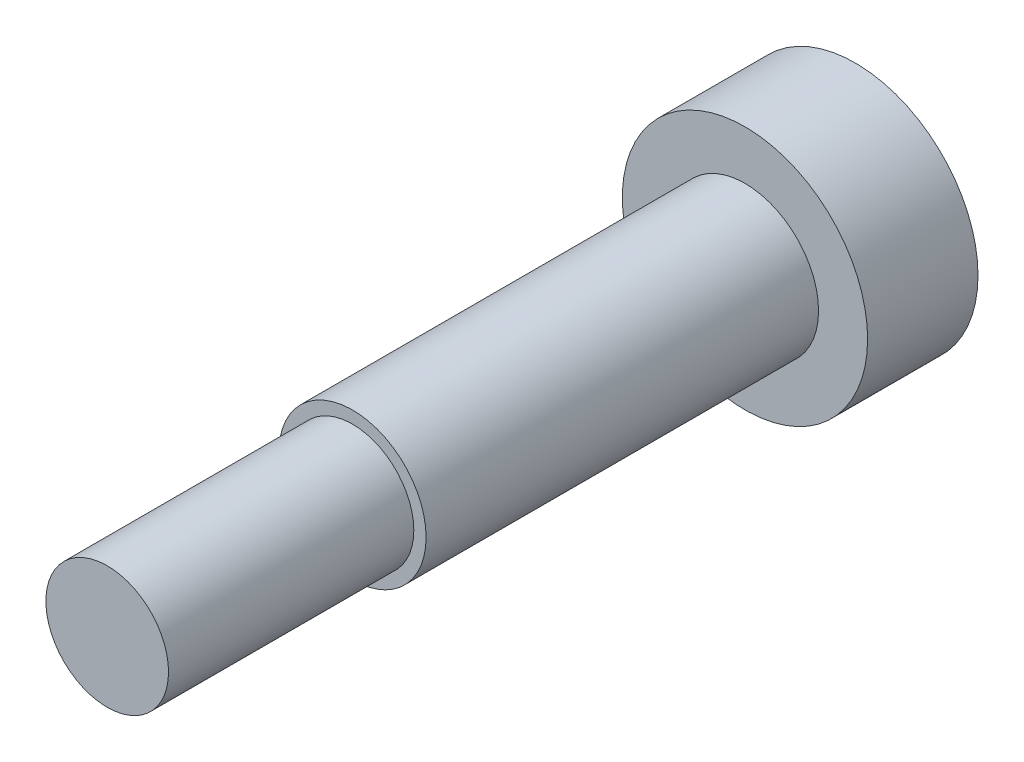
ISO-10303-21;
HEADER;
FILE_DESCRIPTION(('STEP AP214'),'2;1');
FILE_NAME('part.step','',(''),(''),'','','');
FILE_SCHEMA(('AUTOMOTIVE_DESIGN { 1 0 10303 214 1 1 1 1 }'));
ENDSEC;
DATA;
#1=APPLICATION_CONTEXT('core data for automotive mechanical design processes');
#2=APPLICATION_PROTOCOL_DEFINITION('international standard','automotive_design',2000,#1);
#3=PRODUCT_CONTEXT('',#1,'mechanical');
#4=PRODUCT('Part','Part','',(#3));
#5=PRODUCT_RELATED_PRODUCT_CATEGORY('part','',(#4));
#6=PRODUCT_DEFINITION_FORMATION('','',#4);
#7=PRODUCT_DEFINITION_CONTEXT('part definition',#1,'design');
#8=PRODUCT_DEFINITION('design','',#6,#7);
#9=PRODUCT_DEFINITION_SHAPE('','',#8);
#10=(LENGTH_UNIT() NAMED_UNIT(*) SI_UNIT(.MILLI.,.METRE.));
#11=(NAMED_UNIT(*) PLANE_ANGLE_UNIT() SI_UNIT($,.RADIAN.));
#12=(NAMED_UNIT(*) SI_UNIT($,.STERADIAN.) SOLID_ANGLE_UNIT());
#13=UNCERTAINTY_MEASURE_WITH_UNIT(LENGTH_MEASURE(1.E-05),#10,'distance_accuracy_value','');
#14=(GEOMETRIC_REPRESENTATION_CONTEXT(3) GLOBAL_UNCERTAINTY_ASSIGNED_CONTEXT((#13)) GLOBAL_UNIT_ASSIGNED_CONTEXT((#10,
#11,#12)) REPRESENTATION_CONTEXT('',''));
#15=CARTESIAN_POINT('',(0.,0.,0.));
#16=DIRECTION('',(0.,0.,1.));
#17=DIRECTION('',(1.,0.,0.));
#18=AXIS2_PLACEMENT_3D('',#15,#16,#17);
#19=CARTESIAN_POINT('',(0.,0.,4.5));
#20=DIRECTION('',(0.,0.,-1.));
#21=DIRECTION('',(-1.,0.,0.));
#22=AXIS2_PLACEMENT_3D('',#19,#20,#21);
#23=CYLINDRICAL_SURFACE('',#22,5.);
#24=CARTESIAN_POINT('',(0.,0.,4.5));
#25=DIRECTION('',(0.,0.,1.));
#26=DIRECTION('',(1.,0.,0.));
#27=AXIS2_PLACEMENT_3D('',#24,#25,#26);
#28=CIRCLE('',#27,5.);
#29=CARTESIAN_POINT('',(5.,0.,4.5));
#30=VERTEX_POINT('',#29);
#31=EDGE_CURVE('E142',#30,#30,#28,.T.);
#32=ORIENTED_EDGE('',*,*,#31,.F.);
#33=EDGE_LOOP('',(#32));
#34=FACE_BOUND('',#33,.T.);
#35=CARTESIAN_POINT('',(0.,0.,0.));
#36=DIRECTION('',(0.,0.,1.));
#37=DIRECTION('',(1.,0.,0.));
#38=AXIS2_PLACEMENT_3D('',#35,#36,#37);
#39=CIRCLE('',#38,5.);
#40=CARTESIAN_POINT('',(5.,0.,0.));
#41=VERTEX_POINT('',#40);
#42=EDGE_CURVE('E37',#41,#41,#39,.T.);
#43=ORIENTED_EDGE('',*,*,#42,.T.);
#44=EDGE_LOOP('',(#43));
#45=FACE_BOUND('',#44,.T.);
#46=ADVANCED_FACE('F34',(#34,#45),#23,.T.);
#47=CARTESIAN_POINT('',(0.,0.,4.5));
#48=DIRECTION('',(0.,0.,1.));
#49=DIRECTION('',(1.,0.,0.));
#50=AXIS2_PLACEMENT_3D('',#47,#48,#49);
#51=PLANE('',#50);
#52=CARTESIAN_POINT('',(0.,0.,4.5));
#53=DIRECTION('',(0.,0.,1.));
#54=DIRECTION('',(1.,0.,0.));
#55=AXIS2_PLACEMENT_3D('',#52,#53,#54);
#56=CIRCLE('',#55,3.);
#57=CARTESIAN_POINT('',(3.,0.,4.5));
#58=VERTEX_POINT('',#57);
#59=EDGE_CURVE('E42',#58,#58,#56,.T.);
#60=ORIENTED_EDGE('',*,*,#59,.F.);
#61=EDGE_LOOP('',(#60));
#62=FACE_BOUND('',#61,.T.);
#63=ORIENTED_EDGE('',*,*,#31,.T.);
#64=EDGE_LOOP('',(#63));
#65=FACE_BOUND('',#64,.T.);
#66=ADVANCED_FACE('F155',(#62,#65),#51,.T.);
#67=CARTESIAN_POINT('',(0.,0.,0.));
#68=DIRECTION('',(0.,0.,1.));
#69=DIRECTION('',(1.,0.,0.));
#70=AXIS2_PLACEMENT_3D('',#67,#68,#69);
#71=PLANE('',#70);
#72=DIRECTION('',(0.,1.,0.));
#73=VECTOR('',#72,1.);
#74=CARTESIAN_POINT('',(-1.5,-0.866025403784439,0.));
#75=LINE('',#74,#73);
#76=CARTESIAN_POINT('',(-1.5,-0.866025403784439,0.));
#77=VERTEX_POINT('',#76);
#78=CARTESIAN_POINT('',(-1.5,0.866025403784439,0.));
#79=VERTEX_POINT('',#78);
#80=EDGE_CURVE('E124',#77,#79,#75,.T.);
#81=ORIENTED_EDGE('',*,*,#80,.F.);
#82=DIRECTION('',(-0.866025403784439,0.5,0.));
#83=VECTOR('',#82,1.);
#84=CARTESIAN_POINT('',(0.,-1.73205080756888,0.));
#85=LINE('',#84,#83);
#86=CARTESIAN_POINT('',(0.,-1.73205080756888,0.));
#87=VERTEX_POINT('',#86);
#88=EDGE_CURVE('E50',#87,#77,#85,.T.);
#89=ORIENTED_EDGE('',*,*,#88,.F.);
#90=DIRECTION('',(-0.866025403784439,-0.5,0.));
#91=VECTOR('',#90,1.);
#92=CARTESIAN_POINT('',(1.5,-0.866025403784439,0.));
#93=LINE('',#92,#91);
#94=CARTESIAN_POINT('',(1.5,-0.866025403784439,0.));
#95=VERTEX_POINT('',#94);
#96=EDGE_CURVE('E134',#95,#87,#93,.T.);
#97=ORIENTED_EDGE('',*,*,#96,.F.);
#98=DIRECTION('',(0.,-1.,0.));
#99=VECTOR('',#98,1.);
#100=CARTESIAN_POINT('',(1.5,0.866025403784439,0.));
#101=LINE('',#100,#99);
#102=CARTESIAN_POINT('',(1.5,0.866025403784439,0.));
#103=VERTEX_POINT('',#102);
#104=EDGE_CURVE('E132',#103,#95,#101,.T.);
#105=ORIENTED_EDGE('',*,*,#104,.F.);
#106=DIRECTION('',(0.866025403784439,-0.5,0.));
#107=VECTOR('',#106,1.);
#108=CARTESIAN_POINT('',(0.,1.73205080756888,0.));
#109=LINE('',#108,#107);
#110=CARTESIAN_POINT('',(0.,1.73205080756888,0.));
#111=VERTEX_POINT('',#110);
#112=EDGE_CURVE('E98',#111,#103,#109,.T.);
#113=ORIENTED_EDGE('',*,*,#112,.F.);
#114=DIRECTION('',(0.866025403784439,0.5,0.));
#115=VECTOR('',#114,1.);
#116=CARTESIAN_POINT('',(-1.5,0.866025403784439,0.));
#117=LINE('',#116,#115);
#118=EDGE_CURVE('E128',#79,#111,#117,.T.);
#119=ORIENTED_EDGE('',*,*,#118,.F.);
#120=EDGE_LOOP('',(#81,#89,#97,#105,#113,#119));
#121=FACE_BOUND('',#120,.T.);
#122=ORIENTED_EDGE('',*,*,#42,.F.);
#123=EDGE_LOOP('',(#122));
#124=FACE_BOUND('',#123,.T.);
#125=ADVANCED_FACE('F152',(#121,#124),#71,.F.);
#126=CARTESIAN_POINT('',(0.,-1.73205080756888,2.));
#127=DIRECTION('',(-0.5,-0.866025403784439,0.));
#128=DIRECTION('',(0.866025403784439,-0.5,0.));
#129=AXIS2_PLACEMENT_3D('',#126,#127,#128);
#130=PLANE('',#129);
#131=ORIENTED_EDGE('',*,*,#88,.T.);
#132=DIRECTION('',(0.,0.,-1.));
#133=VECTOR('',#132,1.);
#134=CARTESIAN_POINT('',(-1.5,-0.866025403784439,2.));
#135=LINE('',#134,#133);
#136=CARTESIAN_POINT('',(-1.5,-0.866025403784439,2.));
#137=VERTEX_POINT('',#136);
#138=EDGE_CURVE('E80',#137,#77,#135,.T.);
#139=ORIENTED_EDGE('',*,*,#138,.F.);
#140=DIRECTION('',(-0.866025403784439,0.5,0.));
#141=VECTOR('',#140,1.);
#142=CARTESIAN_POINT('',(0.,-1.73205080756888,2.));
#143=LINE('',#142,#141);
#144=CARTESIAN_POINT('',(0.,-1.73205080756888,2.));
#145=VERTEX_POINT('',#144);
#146=EDGE_CURVE('E136',#145,#137,#143,.T.);
#147=ORIENTED_EDGE('',*,*,#146,.F.);
#148=DIRECTION('',(0.,0.,-1.));
#149=VECTOR('',#148,1.);
#150=CARTESIAN_POINT('',(0.,-1.73205080756888,2.));
#151=LINE('',#150,#149);
#152=EDGE_CURVE('E58',#145,#87,#151,.T.);
#153=ORIENTED_EDGE('',*,*,#152,.T.);
#154=EDGE_LOOP('',(#131,#139,#147,#153));
#155=FACE_BOUND('',#154,.T.);
#156=ADVANCED_FACE('F154',(#155),#130,.F.);
#157=CARTESIAN_POINT('',(1.5,-0.866025403784439,2.));
#158=DIRECTION('',(0.5,-0.866025403784439,0.));
#159=DIRECTION('',(0.866025403784439,0.5,0.));
#160=AXIS2_PLACEMENT_3D('',#157,#158,#159);
#161=PLANE('',#160);
#162=ORIENTED_EDGE('',*,*,#96,.T.);
#163=ORIENTED_EDGE('',*,*,#152,.F.);
#164=DIRECTION('',(-0.866025403784439,-0.5,0.));
#165=VECTOR('',#164,1.);
#166=CARTESIAN_POINT('',(1.5,-0.866025403784439,2.));
#167=LINE('',#166,#165);
#168=CARTESIAN_POINT('',(1.5,-0.866025403784439,2.));
#169=VERTEX_POINT('',#168);
#170=EDGE_CURVE('E110',#169,#145,#167,.T.);
#171=ORIENTED_EDGE('',*,*,#170,.F.);
#172=DIRECTION('',(0.,0.,-1.));
#173=VECTOR('',#172,1.);
#174=CARTESIAN_POINT('',(1.5,-0.866025403784439,2.));
#175=LINE('',#174,#173);
#176=EDGE_CURVE('E102',#169,#95,#175,.T.);
#177=ORIENTED_EDGE('',*,*,#176,.T.);
#178=EDGE_LOOP('',(#162,#163,#171,#177));
#179=FACE_BOUND('',#178,.T.);
#180=ADVANCED_FACE('F161',(#179),#161,.F.);
#181=CARTESIAN_POINT('',(1.5,0.866025403784439,2.));
#182=DIRECTION('',(1.,0.,0.));
#183=DIRECTION('',(0.,0.,-1.));
#184=AXIS2_PLACEMENT_3D('',#181,#182,#183);
#185=PLANE('',#184);
#186=ORIENTED_EDGE('',*,*,#104,.T.);
#187=ORIENTED_EDGE('',*,*,#176,.F.);
#188=DIRECTION('',(0.,-1.,0.));
#189=VECTOR('',#188,1.);
#190=CARTESIAN_POINT('',(1.5,0.866025403784439,2.));
#191=LINE('',#190,#189);
#192=CARTESIAN_POINT('',(1.5,0.866025403784439,2.));
#193=VERTEX_POINT('',#192);
#194=EDGE_CURVE('E106',#193,#169,#191,.T.);
#195=ORIENTED_EDGE('',*,*,#194,.F.);
#196=DIRECTION('',(0.,0.,-1.));
#197=VECTOR('',#196,1.);
#198=CARTESIAN_POINT('',(1.5,0.866025403784439,2.));
#199=LINE('',#198,#197);
#200=EDGE_CURVE('E91',#193,#103,#199,.T.);
#201=ORIENTED_EDGE('',*,*,#200,.T.);
#202=EDGE_LOOP('',(#186,#187,#195,#201));
#203=FACE_BOUND('',#202,.T.);
#204=ADVANCED_FACE('F107',(#203),#185,.F.);
#205=CARTESIAN_POINT('',(0.,1.73205080756888,2.));
#206=DIRECTION('',(0.5,0.866025403784439,0.));
#207=DIRECTION('',(-0.866025403784439,0.5,0.));
#208=AXIS2_PLACEMENT_3D('',#205,#206,#207);
#209=PLANE('',#208);
#210=ORIENTED_EDGE('',*,*,#112,.T.);
#211=ORIENTED_EDGE('',*,*,#200,.F.);
#212=DIRECTION('',(0.866025403784439,-0.5,0.));
#213=VECTOR('',#212,1.);
#214=CARTESIAN_POINT('',(0.,1.73205080756888,2.));
#215=LINE('',#214,#213);
#216=CARTESIAN_POINT('',(0.,1.73205080756888,2.));
#217=VERTEX_POINT('',#216);
#218=EDGE_CURVE('E95',#217,#193,#215,.T.);
#219=ORIENTED_EDGE('',*,*,#218,.F.);
#220=DIRECTION('',(0.,0.,-1.));
#221=VECTOR('',#220,1.);
#222=CARTESIAN_POINT('',(0.,1.73205080756888,2.));
#223=LINE('',#222,#221);
#224=EDGE_CURVE('E103',#217,#111,#223,.T.);
#225=ORIENTED_EDGE('',*,*,#224,.T.);
#226=EDGE_LOOP('',(#210,#211,#219,#225));
#227=FACE_BOUND('',#226,.T.);
#228=ADVANCED_FACE('F93',(#227),#209,.F.);
#229=CARTESIAN_POINT('',(-1.5,0.866025403784439,2.));
#230=DIRECTION('',(-0.5,0.866025403784439,0.));
#231=DIRECTION('',(-0.866025403784439,-0.5,0.));
#232=AXIS2_PLACEMENT_3D('',#229,#230,#231);
#233=PLANE('',#232);
#234=ORIENTED_EDGE('',*,*,#118,.T.);
#235=ORIENTED_EDGE('',*,*,#224,.F.);
#236=DIRECTION('',(0.866025403784439,0.5,0.));
#237=VECTOR('',#236,1.);
#238=CARTESIAN_POINT('',(-1.5,0.866025403784439,2.));
#239=LINE('',#238,#237);
#240=CARTESIAN_POINT('',(-1.5,0.866025403784439,2.));
#241=VERTEX_POINT('',#240);
#242=EDGE_CURVE('E116',#241,#217,#239,.T.);
#243=ORIENTED_EDGE('',*,*,#242,.F.);
#244=DIRECTION('',(0.,0.,-1.));
#245=VECTOR('',#244,1.);
#246=CARTESIAN_POINT('',(-1.5,0.866025403784439,2.));
#247=LINE('',#246,#245);
#248=EDGE_CURVE('E140',#241,#79,#247,.T.);
#249=ORIENTED_EDGE('',*,*,#248,.T.);
#250=EDGE_LOOP('',(#234,#235,#243,#249));
#251=FACE_BOUND('',#250,.T.);
#252=ADVANCED_FACE('F234',(#251),#233,.F.);
#253=CARTESIAN_POINT('',(-1.5,-0.866025403784439,2.));
#254=DIRECTION('',(-1.,0.,0.));
#255=DIRECTION('',(0.,-1.,0.));
#256=AXIS2_PLACEMENT_3D('',#253,#254,#255);
#257=PLANE('',#256);
#258=ORIENTED_EDGE('',*,*,#80,.T.);
#259=ORIENTED_EDGE('',*,*,#248,.F.);
#260=DIRECTION('',(0.,1.,0.));
#261=VECTOR('',#260,1.);
#262=CARTESIAN_POINT('',(-1.5,-0.866025403784439,2.));
#263=LINE('',#262,#261);
#264=EDGE_CURVE('E118',#137,#241,#263,.T.);
#265=ORIENTED_EDGE('',*,*,#264,.F.);
#266=ORIENTED_EDGE('',*,*,#138,.T.);
#267=EDGE_LOOP('',(#258,#259,#265,#266));
#268=FACE_BOUND('',#267,.T.);
#269=ADVANCED_FACE('F227',(#268),#257,.F.);
#270=CARTESIAN_POINT('',(0.,0.,2.));
#271=DIRECTION('',(0.,0.,-1.));
#272=DIRECTION('',(-1.,0.,0.));
#273=AXIS2_PLACEMENT_3D('',#270,#271,#272);
#274=PLANE('',#273);
#275=ORIENTED_EDGE('',*,*,#146,.T.);
#276=ORIENTED_EDGE('',*,*,#264,.T.);
#277=ORIENTED_EDGE('',*,*,#242,.T.);
#278=ORIENTED_EDGE('',*,*,#218,.T.);
#279=ORIENTED_EDGE('',*,*,#194,.T.);
#280=ORIENTED_EDGE('',*,*,#170,.T.);
#281=EDGE_LOOP('',(#275,#276,#277,#278,#279,#280));
#282=FACE_BOUND('',#281,.T.);
#283=ADVANCED_FACE('F113',(#282),#274,.T.);
#284=CARTESIAN_POINT('',(0.,0.,20.5));
#285=DIRECTION('',(0.,0.,-1.));
#286=DIRECTION('',(-1.,0.,0.));
#287=AXIS2_PLACEMENT_3D('',#284,#285,#286);
#288=CYLINDRICAL_SURFACE('',#287,3.);
#289=CARTESIAN_POINT('',(0.,0.,20.5));
#290=DIRECTION('',(0.,0.,1.));
#291=DIRECTION('',(1.,0.,0.));
#292=AXIS2_PLACEMENT_3D('',#289,#290,#291);
#293=CIRCLE('',#292,3.);
#294=CARTESIAN_POINT('',(3.,0.,20.5));
#295=VERTEX_POINT('',#294);
#296=EDGE_CURVE('E125',#295,#295,#293,.T.);
#297=ORIENTED_EDGE('',*,*,#296,.F.);
#298=EDGE_LOOP('',(#297));
#299=FACE_BOUND('',#298,.T.);
#300=ORIENTED_EDGE('',*,*,#59,.T.);
#301=EDGE_LOOP('',(#300));
#302=FACE_BOUND('',#301,.T.);
#303=ADVANCED_FACE('F185',(#299,#302),#288,.T.);
#304=CARTESIAN_POINT('',(0.,0.,20.5));
#305=DIRECTION('',(0.,0.,1.));
#306=DIRECTION('',(1.,0.,0.));
#307=AXIS2_PLACEMENT_3D('',#304,#305,#306);
#308=PLANE('',#307);
#309=CARTESIAN_POINT('',(0.,0.,20.5));
#310=DIRECTION('',(0.,0.,1.));
#311=DIRECTION('',(1.,0.,0.));
#312=AXIS2_PLACEMENT_3D('',#309,#310,#311);
#313=CIRCLE('',#312,2.5);
#314=CARTESIAN_POINT('',(2.5,0.,20.5));
#315=VERTEX_POINT('',#314);
#316=EDGE_CURVE('E11',#315,#315,#313,.T.);
#317=ORIENTED_EDGE('',*,*,#316,.F.);
#318=EDGE_LOOP('',(#317));
#319=FACE_BOUND('',#318,.T.);
#320=ORIENTED_EDGE('',*,*,#296,.T.);
#321=EDGE_LOOP('',(#320));
#322=FACE_BOUND('',#321,.T.);
#323=ADVANCED_FACE('F190',(#319,#322),#308,.T.);
#324=CARTESIAN_POINT('',(0.,0.,30.5));
#325=DIRECTION('',(0.,0.,-1.));
#326=DIRECTION('',(-1.,0.,0.));
#327=AXIS2_PLACEMENT_3D('',#324,#325,#326);
#328=CYLINDRICAL_SURFACE('',#327,2.5);
#329=CARTESIAN_POINT('',(0.,0.,30.5));
#330=DIRECTION('',(0.,0.,1.));
#331=DIRECTION('',(1.,0.,0.));
#332=AXIS2_PLACEMENT_3D('',#329,#330,#331);
#333=CIRCLE('',#332,2.5);
#334=CARTESIAN_POINT('',(2.5,0.,30.5));
#335=VERTEX_POINT('',#334);
#336=EDGE_CURVE('E245',#335,#335,#333,.T.);
#337=ORIENTED_EDGE('',*,*,#336,.F.);
#338=EDGE_LOOP('',(#337));
#339=FACE_BOUND('',#338,.T.);
#340=ORIENTED_EDGE('',*,*,#316,.T.);
#341=EDGE_LOOP('',(#340));
#342=FACE_BOUND('',#341,.T.);
#343=ADVANCED_FACE('F200',(#339,#342),#328,.T.);
#344=CARTESIAN_POINT('',(0.,0.,30.5));
#345=DIRECTION('',(0.,0.,1.));
#346=DIRECTION('',(1.,0.,0.));
#347=AXIS2_PLACEMENT_3D('',#344,#345,#346);
#348=PLANE('',#347);
#349=ORIENTED_EDGE('',*,*,#336,.T.);
#350=EDGE_LOOP('',(#349));
#351=FACE_BOUND('',#350,.T.);
#352=ADVANCED_FACE('F210',(#351),#348,.T.);
#353=CLOSED_SHELL('',(#46,#66,#125,#156,#180,#204,#228,#252,#269,#283,#303,#323,#343,#352));
#354=MANIFOLD_SOLID_BREP('B2',#353);
#355=ADVANCED_BREP_SHAPE_REPRESENTATION('',(#18,#354),#14);
#356=SHAPE_DEFINITION_REPRESENTATION(#9,#355);
ENDSEC;
END-ISO-10303-21;
